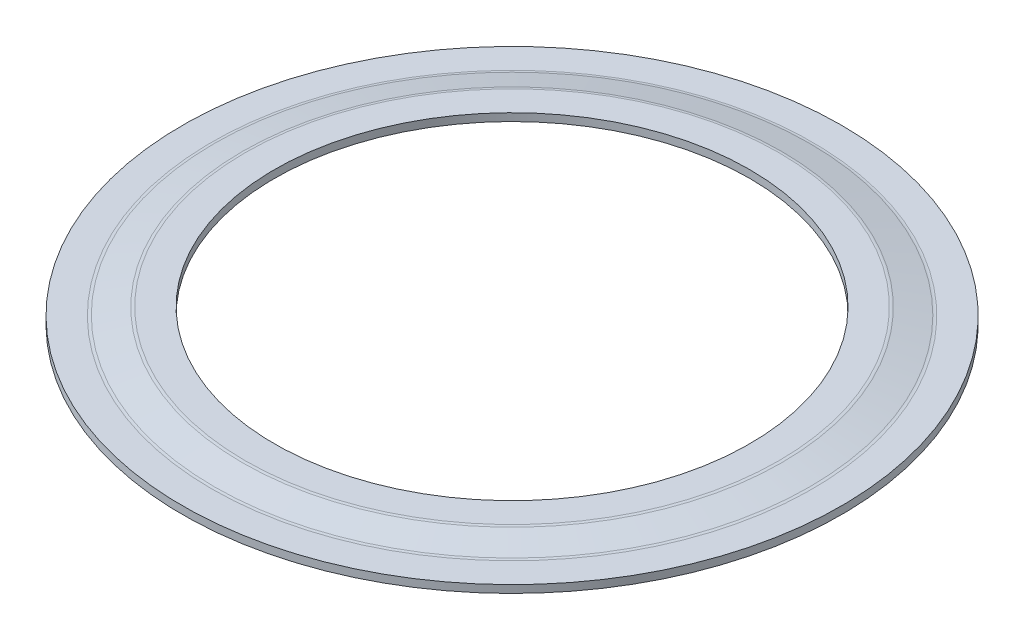
ISO-10303-21;
HEADER;
FILE_DESCRIPTION(('STEP AP214'),'2;1');
FILE_NAME('part.step','',(''),(''),'','','');
FILE_SCHEMA(('AUTOMOTIVE_DESIGN { 1 0 10303 214 1 1 1 1 }'));
ENDSEC;
DATA;
#1=APPLICATION_CONTEXT('core data for automotive mechanical design processes');
#2=APPLICATION_PROTOCOL_DEFINITION('international standard','automotive_design',2000,#1);
#3=PRODUCT_CONTEXT('',#1,'mechanical');
#4=PRODUCT('Part','Part','',(#3));
#5=PRODUCT_RELATED_PRODUCT_CATEGORY('part','',(#4));
#6=PRODUCT_DEFINITION_FORMATION('','',#4);
#7=PRODUCT_DEFINITION_CONTEXT('part definition',#1,'design');
#8=PRODUCT_DEFINITION('design','',#6,#7);
#9=PRODUCT_DEFINITION_SHAPE('','',#8);
#10=(LENGTH_UNIT() NAMED_UNIT(*) SI_UNIT(.MILLI.,.METRE.));
#11=(NAMED_UNIT(*) PLANE_ANGLE_UNIT() SI_UNIT($,.RADIAN.));
#12=(NAMED_UNIT(*) SI_UNIT($,.STERADIAN.) SOLID_ANGLE_UNIT());
#13=UNCERTAINTY_MEASURE_WITH_UNIT(LENGTH_MEASURE(1.E-05),#10,'distance_accuracy_value','');
#14=(GEOMETRIC_REPRESENTATION_CONTEXT(3) GLOBAL_UNCERTAINTY_ASSIGNED_CONTEXT((#13)) GLOBAL_UNIT_ASSIGNED_CONTEXT((#10,
#11,#12)) REPRESENTATION_CONTEXT('',''));
#15=CARTESIAN_POINT('',(0.,0.,0.));
#16=DIRECTION('',(0.,0.,1.));
#17=DIRECTION('',(1.,0.,0.));
#18=AXIS2_PLACEMENT_3D('',#15,#16,#17);
#19=CARTESIAN_POINT('',(0.,0.,0.));
#20=DIRECTION('',(0.,-1.,0.));
#21=DIRECTION('',(0.,0.,-1.));
#22=AXIS2_PLACEMENT_3D('',#19,#20,#21);
#23=CYLINDRICAL_SURFACE('',#22,15.5);
#24=CARTESIAN_POINT('',(0.,0.,0.));
#25=DIRECTION('',(0.,-1.,0.));
#26=DIRECTION('',(0.,0.,-1.));
#27=AXIS2_PLACEMENT_3D('',#24,#25,#26);
#28=CIRCLE('',#27,15.5);
#29=CARTESIAN_POINT('',(0.,0.,-15.5));
#30=VERTEX_POINT('',#29);
#31=EDGE_CURVE('E93',#30,#30,#28,.T.);
#32=ORIENTED_EDGE('',*,*,#31,.T.);
#33=EDGE_LOOP('',(#32));
#34=FACE_BOUND('',#33,.T.);
#35=CARTESIAN_POINT('',(0.,0.5,0.));
#36=DIRECTION('',(0.,-1.,0.));
#37=DIRECTION('',(0.,0.,-1.));
#38=AXIS2_PLACEMENT_3D('',#35,#36,#37);
#39=CIRCLE('',#38,15.5);
#40=CARTESIAN_POINT('',(0.,0.5,-15.5));
#41=VERTEX_POINT('',#40);
#42=EDGE_CURVE('E81',#41,#41,#39,.T.);
#43=ORIENTED_EDGE('',*,*,#42,.F.);
#44=EDGE_LOOP('',(#43));
#45=FACE_BOUND('',#44,.T.);
#46=ADVANCED_FACE('F41',(#34,#45),#23,.F.);
#47=CARTESIAN_POINT('',(0.,0.500000000000001,-15.5));
#48=DIRECTION('',(0.,1.,0.));
#49=DIRECTION('',(0.,0.,1.));
#50=AXIS2_PLACEMENT_3D('',#47,#48,#49);
#51=PLANE('',#50);
#52=CARTESIAN_POINT('',(0.,0.500000000000001,0.));
#53=DIRECTION('',(0.,1.,0.));
#54=DIRECTION('',(0.,0.,1.));
#55=AXIS2_PLACEMENT_3D('',#52,#53,#54);
#56=CIRCLE('',#55,17.4076707807867);
#57=CARTESIAN_POINT('',(0.,0.500000000000001,17.4076707807867));
#58=VERTEX_POINT('',#57);
#59=EDGE_CURVE('E10',#58,#58,#56,.T.);
#60=ORIENTED_EDGE('',*,*,#59,.T.);
#61=EDGE_LOOP('',(#60));
#62=FACE_BOUND('',#61,.T.);
#63=ORIENTED_EDGE('',*,*,#42,.T.);
#64=EDGE_LOOP('',(#63));
#65=FACE_BOUND('',#64,.T.);
#66=ADVANCED_FACE('F117',(#62,#65),#51,.T.);
#67=CARTESIAN_POINT('',(0.,0.,0.));
#68=DIRECTION('',(0.,-1.,0.));
#69=DIRECTION('',(0.,0.,-1.));
#70=AXIS2_PLACEMENT_3D('',#67,#68,#69);
#71=CONICAL_SURFACE('',#70,19.5,1.32581766366803);
#72=CARTESIAN_POINT('',(0.,0.0223931248909959,0.));
#73=DIRECTION('',(0.,-1.,0.));
#74=DIRECTION('',(0.,0.,-1.));
#75=AXIS2_PLACEMENT_3D('',#72,#73,#74);
#76=CIRCLE('',#75,19.410427500436);
#77=CARTESIAN_POINT('',(0.,0.0223931248909959,-19.410427500436));
#78=VERTEX_POINT('',#77);
#79=EDGE_CURVE('E49',#78,#78,#76,.F.);
#80=ORIENTED_EDGE('',*,*,#79,.T.);
#81=EDGE_LOOP('',(#80));
#82=FACE_BOUND('',#81,.T.);
#83=CARTESIAN_POINT('',(0.,0.477606875108999,0.));
#84=DIRECTION('',(0.,1.,0.));
#85=DIRECTION('',(0.,0.,1.));
#86=AXIS2_PLACEMENT_3D('',#83,#84,#85);
#87=CIRCLE('',#86,17.589572499564);
#88=CARTESIAN_POINT('',(0.,0.477606875108999,17.589572499564));
#89=VERTEX_POINT('',#88);
#90=EDGE_CURVE('E54',#89,#89,#87,.F.);
#91=ORIENTED_EDGE('',*,*,#90,.T.);
#92=EDGE_LOOP('',(#91));
#93=FACE_BOUND('',#92,.T.);
#94=ADVANCED_FACE('F122',(#82,#93),#71,.T.);
#95=CARTESIAN_POINT('',(0.,0.,-19.5));
#96=DIRECTION('',(0.,1.,0.));
#97=DIRECTION('',(0.,0.,1.));
#98=AXIS2_PLACEMENT_3D('',#95,#96,#97);
#99=PLANE('',#98);
#100=CARTESIAN_POINT('',(0.,0.,0.));
#101=DIRECTION('',(0.,1.,0.));
#102=DIRECTION('',(0.,0.,1.));
#103=AXIS2_PLACEMENT_3D('',#100,#101,#102);
#104=CIRCLE('',#103,19.5923292192132);
#105=CARTESIAN_POINT('',(0.,0.,19.5923292192132));
#106=VERTEX_POINT('',#105);
#107=EDGE_CURVE('E59',#106,#106,#104,.F.);
#108=ORIENTED_EDGE('',*,*,#107,.T.);
#109=EDGE_LOOP('',(#108));
#110=FACE_BOUND('',#109,.T.);
#111=CARTESIAN_POINT('',(0.,0.,0.));
#112=DIRECTION('',(0.,-1.,0.));
#113=DIRECTION('',(0.,0.,-1.));
#114=AXIS2_PLACEMENT_3D('',#111,#112,#113);
#115=CIRCLE('',#114,21.5);
#116=CARTESIAN_POINT('',(0.,0.,-21.5));
#117=VERTEX_POINT('',#116);
#118=EDGE_CURVE('E85',#117,#117,#115,.T.);
#119=ORIENTED_EDGE('',*,*,#118,.F.);
#120=EDGE_LOOP('',(#119));
#121=FACE_BOUND('',#120,.T.);
#122=ADVANCED_FACE('F138',(#110,#121),#99,.T.);
#123=CARTESIAN_POINT('',(0.,0.,0.));
#124=DIRECTION('',(0.,-1.,0.));
#125=DIRECTION('',(0.,0.,-1.));
#126=AXIS2_PLACEMENT_3D('',#123,#124,#125);
#127=CYLINDRICAL_SURFACE('',#126,21.5);
#128=ORIENTED_EDGE('',*,*,#118,.T.);
#129=EDGE_LOOP('',(#128));
#130=FACE_BOUND('',#129,.T.);
#131=CARTESIAN_POINT('',(0.,-0.500000000000002,0.));
#132=DIRECTION('',(0.,-1.,0.));
#133=DIRECTION('',(0.,0.,-1.));
#134=AXIS2_PLACEMENT_3D('',#131,#132,#133);
#135=CIRCLE('',#134,21.5);
#136=CARTESIAN_POINT('',(0.,-0.500000000000002,-21.5));
#137=VERTEX_POINT('',#136);
#138=EDGE_CURVE('E89',#137,#137,#135,.T.);
#139=ORIENTED_EDGE('',*,*,#138,.F.);
#140=EDGE_LOOP('',(#139));
#141=FACE_BOUND('',#140,.T.);
#142=ADVANCED_FACE('F141',(#130,#141),#127,.T.);
#143=CARTESIAN_POINT('',(0.,-0.5,-21.5));
#144=DIRECTION('',(0.,-1.,0.));
#145=DIRECTION('',(0.,0.,-1.));
#146=AXIS2_PLACEMENT_3D('',#143,#144,#145);
#147=PLANE('',#146);
#148=CARTESIAN_POINT('',(0.,-0.5,0.));
#149=DIRECTION('',(0.,-1.,0.));
#150=DIRECTION('',(0.,0.,-1.));
#151=AXIS2_PLACEMENT_3D('',#148,#149,#150);
#152=CIRCLE('',#151,19.5923292192133);
#153=CARTESIAN_POINT('',(0.,-0.5,-19.5923292192133));
#154=VERTEX_POINT('',#153);
#155=EDGE_CURVE('E65',#154,#154,#152,.F.);
#156=ORIENTED_EDGE('',*,*,#155,.T.);
#157=EDGE_LOOP('',(#156));
#158=FACE_BOUND('',#157,.T.);
#159=ORIENTED_EDGE('',*,*,#138,.T.);
#160=EDGE_LOOP('',(#159));
#161=FACE_BOUND('',#160,.T.);
#162=ADVANCED_FACE('F113',(#158,#161),#147,.T.);
#163=CARTESIAN_POINT('',(0.,0.,0.));
#164=DIRECTION('',(0.,-1.,0.));
#165=DIRECTION('',(0.,0.,-1.));
#166=AXIS2_PLACEMENT_3D('',#163,#164,#165);
#167=CONICAL_SURFACE('',#166,17.5,1.32581766366803);
#168=CARTESIAN_POINT('',(0.,-0.0223931248909959,0.));
#169=DIRECTION('',(0.,-1.,0.));
#170=DIRECTION('',(0.,0.,-1.));
#171=AXIS2_PLACEMENT_3D('',#168,#169,#170);
#172=CIRCLE('',#171,17.589572499564);
#173=CARTESIAN_POINT('',(0.,-0.0223931248909959,-17.589572499564));
#174=VERTEX_POINT('',#173);
#175=EDGE_CURVE('E69',#174,#174,#172,.F.);
#176=ORIENTED_EDGE('',*,*,#175,.T.);
#177=EDGE_LOOP('',(#176));
#178=FACE_BOUND('',#177,.T.);
#179=CARTESIAN_POINT('',(0.,-0.477606875108999,0.));
#180=DIRECTION('',(0.,1.,0.));
#181=DIRECTION('',(0.,0.,1.));
#182=AXIS2_PLACEMENT_3D('',#179,#180,#181);
#183=CIRCLE('',#182,19.410427500436);
#184=CARTESIAN_POINT('',(0.,-0.477606875108999,19.410427500436));
#185=VERTEX_POINT('',#184);
#186=EDGE_CURVE('E73',#185,#185,#183,.F.);
#187=ORIENTED_EDGE('',*,*,#186,.T.);
#188=EDGE_LOOP('',(#187));
#189=FACE_BOUND('',#188,.T.);
#190=ADVANCED_FACE('F103',(#178,#189),#167,.F.);
#191=CARTESIAN_POINT('',(0.,0.,-17.5));
#192=DIRECTION('',(0.,-1.,0.));
#193=DIRECTION('',(0.,0.,-1.));
#194=AXIS2_PLACEMENT_3D('',#191,#192,#193);
#195=PLANE('',#194);
#196=CARTESIAN_POINT('',(0.,0.,0.));
#197=DIRECTION('',(0.,-1.,0.));
#198=DIRECTION('',(0.,0.,-1.));
#199=AXIS2_PLACEMENT_3D('',#196,#197,#198);
#200=CIRCLE('',#199,17.4076707807868);
#201=CARTESIAN_POINT('',(0.,0.,-17.4076707807868));
#202=VERTEX_POINT('',#201);
#203=EDGE_CURVE('E77',#202,#202,#200,.T.);
#204=ORIENTED_EDGE('',*,*,#203,.T.);
#205=EDGE_LOOP('',(#204));
#206=FACE_BOUND('',#205,.T.);
#207=ORIENTED_EDGE('',*,*,#31,.F.);
#208=EDGE_LOOP('',(#207));
#209=FACE_BOUND('',#208,.T.);
#210=ADVANCED_FACE('F100',(#206,#209),#195,.T.);
#211=CARTESIAN_POINT('',(0.,-0.75,0.));
#212=DIRECTION('',(0.,-1.,0.));
#213=DIRECTION('',(0.,0.,-1.));
#214=AXIS2_PLACEMENT_3D('',#211,#212,#213);
#215=TOROIDAL_SURFACE('',#214,17.4076707807868,0.75);
#216=ORIENTED_EDGE('',*,*,#175,.F.);
#217=EDGE_LOOP('',(#216));
#218=FACE_BOUND('',#217,.T.);
#219=ORIENTED_EDGE('',*,*,#203,.F.);
#220=EDGE_LOOP('',(#219));
#221=FACE_BOUND('',#220,.T.);
#222=ADVANCED_FACE('F102',(#218,#221),#215,.F.);
#223=CARTESIAN_POINT('',(0.,0.25,0.));
#224=DIRECTION('',(0.,-1.,0.));
#225=DIRECTION('',(0.,0.,-1.));
#226=AXIS2_PLACEMENT_3D('',#223,#224,#225);
#227=TOROIDAL_SURFACE('',#226,19.5923292192133,0.75);
#228=ORIENTED_EDGE('',*,*,#155,.F.);
#229=EDGE_LOOP('',(#228));
#230=FACE_BOUND('',#229,.T.);
#231=ORIENTED_EDGE('',*,*,#186,.F.);
#232=EDGE_LOOP('',(#231));
#233=FACE_BOUND('',#232,.T.);
#234=ADVANCED_FACE('F110',(#230,#233),#227,.T.);
#235=CARTESIAN_POINT('',(0.,0.75,0.));
#236=DIRECTION('',(0.,1.,0.));
#237=DIRECTION('',(0.,0.,1.));
#238=AXIS2_PLACEMENT_3D('',#235,#236,#237);
#239=TOROIDAL_SURFACE('',#238,19.5923292192132,0.75);
#240=ORIENTED_EDGE('',*,*,#79,.F.);
#241=EDGE_LOOP('',(#240));
#242=FACE_BOUND('',#241,.T.);
#243=ORIENTED_EDGE('',*,*,#107,.F.);
#244=EDGE_LOOP('',(#243));
#245=FACE_BOUND('',#244,.T.);
#246=ADVANCED_FACE('F127',(#242,#245),#239,.F.);
#247=CARTESIAN_POINT('',(0.,-0.249999999999999,0.));
#248=DIRECTION('',(0.,1.,0.));
#249=DIRECTION('',(0.,0.,1.));
#250=AXIS2_PLACEMENT_3D('',#247,#248,#249);
#251=TOROIDAL_SURFACE('',#250,17.4076707807867,0.75);
#252=ORIENTED_EDGE('',*,*,#59,.F.);
#253=EDGE_LOOP('',(#252));
#254=FACE_BOUND('',#253,.T.);
#255=ORIENTED_EDGE('',*,*,#90,.F.);
#256=EDGE_LOOP('',(#255));
#257=FACE_BOUND('',#256,.T.);
#258=ADVANCED_FACE('F43',(#254,#257),#251,.T.);
#259=CLOSED_SHELL('',(#46,#66,#94,#122,#142,#162,#190,#210,#222,#234,#246,#258));
#260=MANIFOLD_SOLID_BREP('B2',#259);
#261=ADVANCED_BREP_SHAPE_REPRESENTATION('',(#18,#260),#14);
#262=SHAPE_DEFINITION_REPRESENTATION(#9,#261);
ENDSEC;
END-ISO-10303-21;
